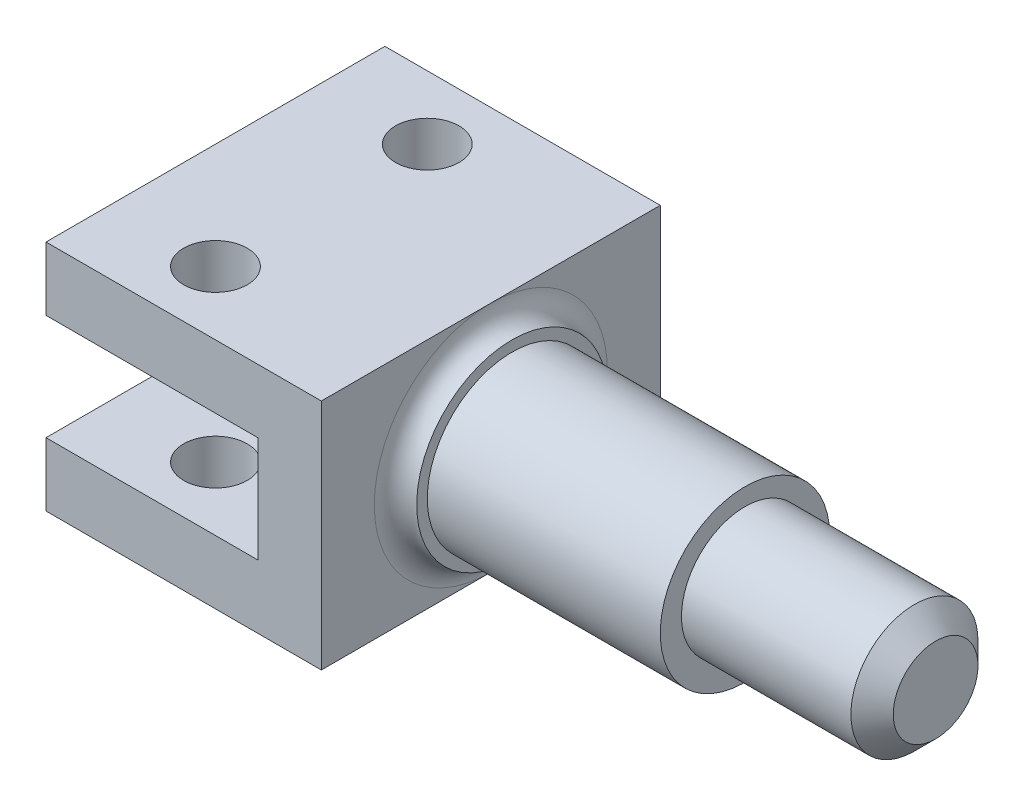
ISO-10303-21;
HEADER;
FILE_DESCRIPTION(('STEP AP214'),'2;1');
FILE_NAME('part.step','',(''),(''),'','','');
FILE_SCHEMA(('AUTOMOTIVE_DESIGN { 1 0 10303 214 1 1 1 1 }'));
ENDSEC;
DATA;
#1=APPLICATION_CONTEXT('core data for automotive mechanical design processes');
#2=APPLICATION_PROTOCOL_DEFINITION('international standard','automotive_design',2000,#1);
#3=PRODUCT_CONTEXT('',#1,'mechanical');
#4=PRODUCT('Part','Part','',(#3));
#5=PRODUCT_RELATED_PRODUCT_CATEGORY('part','',(#4));
#6=PRODUCT_DEFINITION_FORMATION('','',#4);
#7=PRODUCT_DEFINITION_CONTEXT('part definition',#1,'design');
#8=PRODUCT_DEFINITION('design','',#6,#7);
#9=PRODUCT_DEFINITION_SHAPE('','',#8);
#10=(LENGTH_UNIT() NAMED_UNIT(*) SI_UNIT(.MILLI.,.METRE.));
#11=(NAMED_UNIT(*) PLANE_ANGLE_UNIT() SI_UNIT($,.RADIAN.));
#12=(NAMED_UNIT(*) SI_UNIT($,.STERADIAN.) SOLID_ANGLE_UNIT());
#13=UNCERTAINTY_MEASURE_WITH_UNIT(LENGTH_MEASURE(1.E-05),#10,'distance_accuracy_value','');
#14=(GEOMETRIC_REPRESENTATION_CONTEXT(3) GLOBAL_UNCERTAINTY_ASSIGNED_CONTEXT((#13)) GLOBAL_UNIT_ASSIGNED_CONTEXT((#10,
#11,#12)) REPRESENTATION_CONTEXT('',''));
#15=CARTESIAN_POINT('',(0.,0.,0.));
#16=DIRECTION('',(0.,0.,1.));
#17=DIRECTION('',(1.,0.,0.));
#18=AXIS2_PLACEMENT_3D('',#15,#16,#17);
#19=CARTESIAN_POINT('',(13.,0.,16.));
#20=DIRECTION('',(-1.,0.,0.));
#21=DIRECTION('',(0.,0.,1.));
#22=AXIS2_PLACEMENT_3D('',#19,#20,#21);
#23=PLANE('',#22);
#24=DIRECTION('',(0.,0.,-1.));
#25=VECTOR('',#24,1.);
#26=CARTESIAN_POINT('',(13.,0.,16.));
#27=LINE('',#26,#25);
#28=CARTESIAN_POINT('',(13.,0.,16.));
#29=VERTEX_POINT('',#28);
#30=CARTESIAN_POINT('',(13.,0.,8.));
#31=VERTEX_POINT('',#30);
#32=EDGE_CURVE('E114',#29,#31,#27,.T.);
#33=ORIENTED_EDGE('',*,*,#32,.T.);
#34=CARTESIAN_POINT('',(13.,5.5,8.));
#35=DIRECTION('',(-1.,0.,0.));
#36=DIRECTION('',(0.,0.,1.));
#37=AXIS2_PLACEMENT_3D('',#34,#35,#36);
#38=CIRCLE('',#37,5.5);
#39=CARTESIAN_POINT('',(13.,11.,8.));
#40=VERTEX_POINT('',#39);
#41=EDGE_CURVE('E133',#31,#40,#38,.T.);
#42=ORIENTED_EDGE('',*,*,#41,.T.);
#43=DIRECTION('',(0.,0.,-1.));
#44=VECTOR('',#43,1.);
#45=CARTESIAN_POINT('',(13.,11.,16.));
#46=LINE('',#45,#44);
#47=CARTESIAN_POINT('',(13.,11.,16.));
#48=VERTEX_POINT('',#47);
#49=EDGE_CURVE('E220',#48,#40,#46,.T.);
#50=ORIENTED_EDGE('',*,*,#49,.F.);
#51=DIRECTION('',(0.,1.,0.));
#52=VECTOR('',#51,1.);
#53=CARTESIAN_POINT('',(13.,0.,16.));
#54=LINE('',#53,#52);
#55=EDGE_CURVE('E117',#29,#48,#54,.T.);
#56=ORIENTED_EDGE('',*,*,#55,.F.);
#57=EDGE_LOOP('',(#33,#42,#50,#56));
#58=FACE_BOUND('',#57,.T.);
#59=ADVANCED_FACE('F36',(#58),#23,.F.);
#60=CARTESIAN_POINT('',(0.,3.,16.));
#61=DIRECTION('',(1.,0.,0.));
#62=DIRECTION('',(0.,0.,-1.));
#63=AXIS2_PLACEMENT_3D('',#60,#61,#62);
#64=PLANE('',#63);
#65=DIRECTION('',(0.,-1.,0.));
#66=VECTOR('',#65,1.);
#67=CARTESIAN_POINT('',(0.,3.,0.));
#68=LINE('',#67,#66);
#69=CARTESIAN_POINT('',(0.,3.,0.));
#70=VERTEX_POINT('',#69);
#71=CARTESIAN_POINT('',(0.,0.,0.));
#72=VERTEX_POINT('',#71);
#73=EDGE_CURVE('E131',#70,#72,#68,.T.);
#74=ORIENTED_EDGE('',*,*,#73,.T.);
#75=DIRECTION('',(0.,0.,-1.));
#76=VECTOR('',#75,1.);
#77=CARTESIAN_POINT('',(0.,0.,16.));
#78=LINE('',#77,#76);
#79=CARTESIAN_POINT('',(0.,0.,16.));
#80=VERTEX_POINT('',#79);
#81=EDGE_CURVE('E111',#80,#72,#78,.T.);
#82=ORIENTED_EDGE('',*,*,#81,.F.);
#83=DIRECTION('',(0.,-1.,0.));
#84=VECTOR('',#83,1.);
#85=CARTESIAN_POINT('',(0.,3.,16.));
#86=LINE('',#85,#84);
#87=CARTESIAN_POINT('',(0.,3.,16.));
#88=VERTEX_POINT('',#87);
#89=EDGE_CURVE('E118',#88,#80,#86,.T.);
#90=ORIENTED_EDGE('',*,*,#89,.F.);
#91=DIRECTION('',(0.,0.,-1.));
#92=VECTOR('',#91,1.);
#93=CARTESIAN_POINT('',(0.,3.,16.));
#94=LINE('',#93,#92);
#95=EDGE_CURVE('E191',#88,#70,#94,.T.);
#96=ORIENTED_EDGE('',*,*,#95,.T.);
#97=EDGE_LOOP('',(#74,#82,#90,#96));
#98=FACE_BOUND('',#97,.T.);
#99=ADVANCED_FACE('F129',(#98),#64,.F.);
#100=CARTESIAN_POINT('',(0.,0.,16.));
#101=DIRECTION('',(0.,1.,0.));
#102=DIRECTION('',(0.,0.,1.));
#103=AXIS2_PLACEMENT_3D('',#100,#101,#102);
#104=PLANE('',#103);
#105=CARTESIAN_POINT('',(5.,0.,3.));
#106=DIRECTION('',(0.,1.,0.));
#107=DIRECTION('',(0.,0.,1.));
#108=AXIS2_PLACEMENT_3D('',#105,#106,#107);
#109=CIRCLE('',#108,1.5);
#110=CARTESIAN_POINT('',(5.,0.,4.5));
#111=VERTEX_POINT('',#110);
#112=EDGE_CURVE('E178',#111,#111,#109,.T.);
#113=ORIENTED_EDGE('',*,*,#112,.T.);
#114=EDGE_LOOP('',(#113));
#115=FACE_BOUND('',#114,.T.);
#116=CARTESIAN_POINT('',(5.,0.,13.));
#117=DIRECTION('',(0.,1.,0.));
#118=DIRECTION('',(0.,0.,1.));
#119=AXIS2_PLACEMENT_3D('',#116,#117,#118);
#120=CIRCLE('',#119,1.5);
#121=CARTESIAN_POINT('',(5.,0.,14.5));
#122=VERTEX_POINT('',#121);
#123=EDGE_CURVE('E147',#122,#122,#120,.T.);
#124=ORIENTED_EDGE('',*,*,#123,.T.);
#125=EDGE_LOOP('',(#124));
#126=FACE_BOUND('',#125,.T.);
#127=DIRECTION('',(1.,0.,0.));
#128=VECTOR('',#127,1.);
#129=CARTESIAN_POINT('',(0.,0.,0.));
#130=LINE('',#129,#128);
#131=CARTESIAN_POINT('',(13.,0.,0.));
#132=VERTEX_POINT('',#131);
#133=EDGE_CURVE('E193',#72,#132,#130,.T.);
#134=ORIENTED_EDGE('',*,*,#133,.T.);
#135=EDGE_CURVE('E135',#31,#132,#27,.T.);
#136=ORIENTED_EDGE('',*,*,#135,.F.);
#137=ORIENTED_EDGE('',*,*,#32,.F.);
#138=DIRECTION('',(1.,0.,0.));
#139=VECTOR('',#138,1.);
#140=CARTESIAN_POINT('',(0.,0.,16.));
#141=LINE('',#140,#139);
#142=EDGE_CURVE('E106',#80,#29,#141,.T.);
#143=ORIENTED_EDGE('',*,*,#142,.F.);
#144=ORIENTED_EDGE('',*,*,#81,.T.);
#145=EDGE_LOOP('',(#134,#136,#137,#143,#144));
#146=FACE_BOUND('',#145,.T.);
#147=ADVANCED_FACE('F109',(#115,#126,#146),#104,.F.);
#148=CARTESIAN_POINT('',(13.,11.,0.));
#149=VERTEX_POINT('',#148);
#150=EDGE_CURVE('E219',#40,#149,#46,.T.);
#151=ORIENTED_EDGE('',*,*,#150,.F.);
#152=CARTESIAN_POINT('',(13.,5.5,8.));
#153=DIRECTION('',(-1.,0.,0.));
#154=DIRECTION('',(0.,0.,1.));
#155=AXIS2_PLACEMENT_3D('',#152,#153,#154);
#156=CIRCLE('',#155,5.5);
#157=EDGE_CURVE('E51',#40,#31,#156,.T.);
#158=ORIENTED_EDGE('',*,*,#157,.T.);
#159=ORIENTED_EDGE('',*,*,#135,.T.);
#160=DIRECTION('',(0.,1.,0.));
#161=VECTOR('',#160,1.);
#162=CARTESIAN_POINT('',(13.,0.,0.));
#163=LINE('',#162,#161);
#164=EDGE_CURVE('E195',#132,#149,#163,.T.);
#165=ORIENTED_EDGE('',*,*,#164,.T.);
#166=EDGE_LOOP('',(#151,#158,#159,#165));
#167=FACE_BOUND('',#166,.T.);
#168=ADVANCED_FACE('F229',(#167),#23,.F.);
#169=CARTESIAN_POINT('',(13.,11.,16.));
#170=DIRECTION('',(0.,-1.,0.));
#171=DIRECTION('',(0.,0.,-1.));
#172=AXIS2_PLACEMENT_3D('',#169,#170,#171);
#173=PLANE('',#172);
#174=CARTESIAN_POINT('',(5.,11.,3.));
#175=DIRECTION('',(0.,1.,0.));
#176=DIRECTION('',(0.,0.,1.));
#177=AXIS2_PLACEMENT_3D('',#174,#175,#176);
#178=CIRCLE('',#177,1.5);
#179=CARTESIAN_POINT('',(5.,11.,4.5));
#180=VERTEX_POINT('',#179);
#181=EDGE_CURVE('E143',#180,#180,#178,.T.);
#182=ORIENTED_EDGE('',*,*,#181,.F.);
#183=EDGE_LOOP('',(#182));
#184=FACE_BOUND('',#183,.T.);
#185=CARTESIAN_POINT('',(5.,11.,13.));
#186=DIRECTION('',(0.,1.,0.));
#187=DIRECTION('',(0.,0.,-1.));
#188=AXIS2_PLACEMENT_3D('',#185,#186,#187);
#189=CIRCLE('',#188,1.5);
#190=CARTESIAN_POINT('',(5.,11.,11.5));
#191=VERTEX_POINT('',#190);
#192=EDGE_CURVE('E167',#191,#191,#189,.T.);
#193=ORIENTED_EDGE('',*,*,#192,.F.);
#194=EDGE_LOOP('',(#193));
#195=FACE_BOUND('',#194,.T.);
#196=DIRECTION('',(-1.,0.,0.));
#197=VECTOR('',#196,1.);
#198=CARTESIAN_POINT('',(13.,11.,0.));
#199=LINE('',#198,#197);
#200=CARTESIAN_POINT('',(0.,11.,0.));
#201=VERTEX_POINT('',#200);
#202=EDGE_CURVE('E198',#149,#201,#199,.T.);
#203=ORIENTED_EDGE('',*,*,#202,.T.);
#204=DIRECTION('',(0.,0.,-1.));
#205=VECTOR('',#204,1.);
#206=CARTESIAN_POINT('',(0.,11.,16.));
#207=LINE('',#206,#205);
#208=CARTESIAN_POINT('',(0.,11.,16.));
#209=VERTEX_POINT('',#208);
#210=EDGE_CURVE('E217',#209,#201,#207,.T.);
#211=ORIENTED_EDGE('',*,*,#210,.F.);
#212=DIRECTION('',(-1.,0.,0.));
#213=VECTOR('',#212,1.);
#214=CARTESIAN_POINT('',(13.,11.,16.));
#215=LINE('',#214,#213);
#216=EDGE_CURVE('E182',#48,#209,#215,.T.);
#217=ORIENTED_EDGE('',*,*,#216,.F.);
#218=ORIENTED_EDGE('',*,*,#49,.T.);
#219=ORIENTED_EDGE('',*,*,#150,.T.);
#220=EDGE_LOOP('',(#203,#211,#217,#218,#219));
#221=FACE_BOUND('',#220,.T.);
#222=ADVANCED_FACE('F225',(#184,#195,#221),#173,.F.);
#223=CARTESIAN_POINT('',(0.,11.,16.));
#224=DIRECTION('',(1.,0.,0.));
#225=DIRECTION('',(0.,0.,-1.));
#226=AXIS2_PLACEMENT_3D('',#223,#224,#225);
#227=PLANE('',#226);
#228=DIRECTION('',(0.,-1.,0.));
#229=VECTOR('',#228,1.);
#230=CARTESIAN_POINT('',(0.,11.,0.));
#231=LINE('',#230,#229);
#232=CARTESIAN_POINT('',(0.,8.,0.));
#233=VERTEX_POINT('',#232);
#234=EDGE_CURVE('E200',#201,#233,#231,.T.);
#235=ORIENTED_EDGE('',*,*,#234,.T.);
#236=DIRECTION('',(0.,0.,-1.));
#237=VECTOR('',#236,1.);
#238=CARTESIAN_POINT('',(0.,8.,16.));
#239=LINE('',#238,#237);
#240=CARTESIAN_POINT('',(0.,8.,16.));
#241=VERTEX_POINT('',#240);
#242=EDGE_CURVE('E214',#241,#233,#239,.T.);
#243=ORIENTED_EDGE('',*,*,#242,.F.);
#244=DIRECTION('',(0.,-1.,0.));
#245=VECTOR('',#244,1.);
#246=CARTESIAN_POINT('',(0.,11.,16.));
#247=LINE('',#246,#245);
#248=EDGE_CURVE('E184',#209,#241,#247,.T.);
#249=ORIENTED_EDGE('',*,*,#248,.F.);
#250=ORIENTED_EDGE('',*,*,#210,.T.);
#251=EDGE_LOOP('',(#235,#243,#249,#250));
#252=FACE_BOUND('',#251,.T.);
#253=ADVANCED_FACE('F237',(#252),#227,.F.);
#254=CARTESIAN_POINT('',(0.,8.,16.));
#255=DIRECTION('',(0.,1.,0.));
#256=DIRECTION('',(0.,0.,1.));
#257=AXIS2_PLACEMENT_3D('',#254,#255,#256);
#258=PLANE('',#257);
#259=CARTESIAN_POINT('',(5.,8.,3.));
#260=DIRECTION('',(0.,1.,0.));
#261=DIRECTION('',(0.,0.,1.));
#262=AXIS2_PLACEMENT_3D('',#259,#260,#261);
#263=CIRCLE('',#262,1.5);
#264=CARTESIAN_POINT('',(5.,8.,4.5));
#265=VERTEX_POINT('',#264);
#266=EDGE_CURVE('E146',#265,#265,#263,.T.);
#267=ORIENTED_EDGE('',*,*,#266,.T.);
#268=EDGE_LOOP('',(#267));
#269=FACE_BOUND('',#268,.T.);
#270=CARTESIAN_POINT('',(5.,8.,13.));
#271=DIRECTION('',(0.,1.,0.));
#272=DIRECTION('',(0.,0.,1.));
#273=AXIS2_PLACEMENT_3D('',#270,#271,#272);
#274=CIRCLE('',#273,1.5);
#275=CARTESIAN_POINT('',(5.,8.,14.5));
#276=VERTEX_POINT('',#275);
#277=EDGE_CURVE('E142',#276,#276,#274,.T.);
#278=ORIENTED_EDGE('',*,*,#277,.T.);
#279=EDGE_LOOP('',(#278));
#280=FACE_BOUND('',#279,.T.);
#281=DIRECTION('',(1.,0.,0.));
#282=VECTOR('',#281,1.);
#283=CARTESIAN_POINT('',(0.,8.,0.));
#284=LINE('',#283,#282);
#285=CARTESIAN_POINT('',(10.,8.,0.));
#286=VERTEX_POINT('',#285);
#287=EDGE_CURVE('E202',#233,#286,#284,.T.);
#288=ORIENTED_EDGE('',*,*,#287,.T.);
#289=DIRECTION('',(0.,0.,-1.));
#290=VECTOR('',#289,1.);
#291=CARTESIAN_POINT('',(10.,8.,16.));
#292=LINE('',#291,#290);
#293=CARTESIAN_POINT('',(10.,8.,16.));
#294=VERTEX_POINT('',#293);
#295=EDGE_CURVE('E211',#294,#286,#292,.T.);
#296=ORIENTED_EDGE('',*,*,#295,.F.);
#297=DIRECTION('',(1.,0.,0.));
#298=VECTOR('',#297,1.);
#299=CARTESIAN_POINT('',(0.,8.,16.));
#300=LINE('',#299,#298);
#301=EDGE_CURVE('E186',#241,#294,#300,.T.);
#302=ORIENTED_EDGE('',*,*,#301,.F.);
#303=ORIENTED_EDGE('',*,*,#242,.T.);
#304=EDGE_LOOP('',(#288,#296,#302,#303));
#305=FACE_BOUND('',#304,.T.);
#306=ADVANCED_FACE('F241',(#269,#280,#305),#258,.F.);
#307=CARTESIAN_POINT('',(10.,8.,16.));
#308=DIRECTION('',(1.,0.,0.));
#309=DIRECTION('',(0.,0.,-1.));
#310=AXIS2_PLACEMENT_3D('',#307,#308,#309);
#311=PLANE('',#310);
#312=DIRECTION('',(0.,-1.,0.));
#313=VECTOR('',#312,1.);
#314=CARTESIAN_POINT('',(10.,8.,0.));
#315=LINE('',#314,#313);
#316=CARTESIAN_POINT('',(10.,3.,0.));
#317=VERTEX_POINT('',#316);
#318=EDGE_CURVE('E204',#286,#317,#315,.T.);
#319=ORIENTED_EDGE('',*,*,#318,.T.);
#320=DIRECTION('',(0.,0.,-1.));
#321=VECTOR('',#320,1.);
#322=CARTESIAN_POINT('',(10.,3.,16.));
#323=LINE('',#322,#321);
#324=CARTESIAN_POINT('',(10.,3.,16.));
#325=VERTEX_POINT('',#324);
#326=EDGE_CURVE('E208',#325,#317,#323,.T.);
#327=ORIENTED_EDGE('',*,*,#326,.F.);
#328=DIRECTION('',(0.,-1.,0.));
#329=VECTOR('',#328,1.);
#330=CARTESIAN_POINT('',(10.,8.,16.));
#331=LINE('',#330,#329);
#332=EDGE_CURVE('E188',#294,#325,#331,.T.);
#333=ORIENTED_EDGE('',*,*,#332,.F.);
#334=ORIENTED_EDGE('',*,*,#295,.T.);
#335=EDGE_LOOP('',(#319,#327,#333,#334));
#336=FACE_BOUND('',#335,.T.);
#337=ADVANCED_FACE('F308',(#336),#311,.F.);
#338=CARTESIAN_POINT('',(10.,3.,16.));
#339=DIRECTION('',(0.,-1.,0.));
#340=DIRECTION('',(0.,0.,-1.));
#341=AXIS2_PLACEMENT_3D('',#338,#339,#340);
#342=PLANE('',#341);
#343=CARTESIAN_POINT('',(5.,3.,3.));
#344=DIRECTION('',(0.,-1.,0.));
#345=DIRECTION('',(0.,0.,-1.));
#346=AXIS2_PLACEMENT_3D('',#343,#344,#345);
#347=CIRCLE('',#346,1.5);
#348=CARTESIAN_POINT('',(5.,3.,1.5));
#349=VERTEX_POINT('',#348);
#350=EDGE_CURVE('E144',#349,#349,#347,.T.);
#351=ORIENTED_EDGE('',*,*,#350,.T.);
#352=EDGE_LOOP('',(#351));
#353=FACE_BOUND('',#352,.T.);
#354=CARTESIAN_POINT('',(5.,3.,13.));
#355=DIRECTION('',(0.,-1.,0.));
#356=DIRECTION('',(0.,0.,-1.));
#357=AXIS2_PLACEMENT_3D('',#354,#355,#356);
#358=CIRCLE('',#357,1.5);
#359=CARTESIAN_POINT('',(5.,3.,11.5));
#360=VERTEX_POINT('',#359);
#361=EDGE_CURVE('E139',#360,#360,#358,.T.);
#362=ORIENTED_EDGE('',*,*,#361,.T.);
#363=EDGE_LOOP('',(#362));
#364=FACE_BOUND('',#363,.T.);
#365=DIRECTION('',(-1.,0.,0.));
#366=VECTOR('',#365,1.);
#367=CARTESIAN_POINT('',(10.,3.,0.));
#368=LINE('',#367,#366);
#369=EDGE_CURVE('E127',#317,#70,#368,.T.);
#370=ORIENTED_EDGE('',*,*,#369,.T.);
#371=ORIENTED_EDGE('',*,*,#95,.F.);
#372=DIRECTION('',(-1.,0.,0.));
#373=VECTOR('',#372,1.);
#374=CARTESIAN_POINT('',(10.,3.,16.));
#375=LINE('',#374,#373);
#376=EDGE_CURVE('E123',#325,#88,#375,.T.);
#377=ORIENTED_EDGE('',*,*,#376,.F.);
#378=ORIENTED_EDGE('',*,*,#326,.T.);
#379=EDGE_LOOP('',(#370,#371,#377,#378));
#380=FACE_BOUND('',#379,.T.);
#381=ADVANCED_FACE('F315',(#353,#364,#380),#342,.F.);
#382=CARTESIAN_POINT('',(0.,0.,16.));
#383=DIRECTION('',(0.,0.,1.));
#384=DIRECTION('',(1.,0.,0.));
#385=AXIS2_PLACEMENT_3D('',#382,#383,#384);
#386=PLANE('',#385);
#387=ORIENTED_EDGE('',*,*,#89,.T.);
#388=ORIENTED_EDGE('',*,*,#142,.T.);
#389=ORIENTED_EDGE('',*,*,#55,.T.);
#390=ORIENTED_EDGE('',*,*,#216,.T.);
#391=ORIENTED_EDGE('',*,*,#248,.T.);
#392=ORIENTED_EDGE('',*,*,#301,.T.);
#393=ORIENTED_EDGE('',*,*,#332,.T.);
#394=ORIENTED_EDGE('',*,*,#376,.T.);
#395=EDGE_LOOP('',(#387,#388,#389,#390,#391,#392,#393,#394));
#396=FACE_BOUND('',#395,.T.);
#397=ADVANCED_FACE('F121',(#396),#386,.T.);
#398=CARTESIAN_POINT('',(0.,0.,0.));
#399=DIRECTION('',(0.,0.,1.));
#400=DIRECTION('',(1.,0.,0.));
#401=AXIS2_PLACEMENT_3D('',#398,#399,#400);
#402=PLANE('',#401);
#403=ORIENTED_EDGE('',*,*,#73,.F.);
#404=ORIENTED_EDGE('',*,*,#369,.F.);
#405=ORIENTED_EDGE('',*,*,#318,.F.);
#406=ORIENTED_EDGE('',*,*,#287,.F.);
#407=ORIENTED_EDGE('',*,*,#234,.F.);
#408=ORIENTED_EDGE('',*,*,#202,.F.);
#409=ORIENTED_EDGE('',*,*,#164,.F.);
#410=ORIENTED_EDGE('',*,*,#133,.F.);
#411=EDGE_LOOP('',(#403,#404,#405,#406,#407,#408,#409,#410));
#412=FACE_BOUND('',#411,.T.);
#413=ADVANCED_FACE('F232',(#412),#402,.F.);
#414=CARTESIAN_POINT('',(5.,-5.,13.));
#415=DIRECTION('',(0.,1.,0.));
#416=DIRECTION('',(0.,0.,1.));
#417=AXIS2_PLACEMENT_3D('',#414,#415,#416);
#418=CYLINDRICAL_SURFACE('',#417,1.5);
#419=ORIENTED_EDGE('',*,*,#361,.F.);
#420=EDGE_LOOP('',(#419));
#421=FACE_BOUND('',#420,.T.);
#422=ORIENTED_EDGE('',*,*,#123,.F.);
#423=EDGE_LOOP('',(#422));
#424=FACE_BOUND('',#423,.T.);
#425=ADVANCED_FACE('F287',(#421,#424),#418,.F.);
#426=CARTESIAN_POINT('',(5.,-5.,3.));
#427=DIRECTION('',(0.,1.,0.));
#428=DIRECTION('',(0.,0.,1.));
#429=AXIS2_PLACEMENT_3D('',#426,#427,#428);
#430=CYLINDRICAL_SURFACE('',#429,1.5);
#431=ORIENTED_EDGE('',*,*,#350,.F.);
#432=EDGE_LOOP('',(#431));
#433=FACE_BOUND('',#432,.T.);
#434=ORIENTED_EDGE('',*,*,#112,.F.);
#435=EDGE_LOOP('',(#434));
#436=FACE_BOUND('',#435,.T.);
#437=ADVANCED_FACE('F263',(#433,#436),#430,.F.);
#438=ORIENTED_EDGE('',*,*,#192,.T.);
#439=EDGE_LOOP('',(#438));
#440=FACE_BOUND('',#439,.T.);
#441=ORIENTED_EDGE('',*,*,#277,.F.);
#442=EDGE_LOOP('',(#441));
#443=FACE_BOUND('',#442,.T.);
#444=ADVANCED_FACE('F260',(#440,#443),#418,.F.);
#445=ORIENTED_EDGE('',*,*,#181,.T.);
#446=EDGE_LOOP('',(#445));
#447=FACE_BOUND('',#446,.T.);
#448=ORIENTED_EDGE('',*,*,#266,.F.);
#449=EDGE_LOOP('',(#448));
#450=FACE_BOUND('',#449,.T.);
#451=ADVANCED_FACE('F254',(#447,#450),#430,.F.);
#452=CARTESIAN_POINT('',(14.,5.5,8.));
#453=DIRECTION('',(1.,0.,0.));
#454=DIRECTION('',(0.,0.,-1.));
#455=AXIS2_PLACEMENT_3D('',#452,#453,#454);
#456=PLANE('',#455);
#457=CARTESIAN_POINT('',(14.,5.5,8.));
#458=DIRECTION('',(1.,0.,0.));
#459=DIRECTION('',(0.,0.,-1.));
#460=AXIS2_PLACEMENT_3D('',#457,#458,#459);
#461=CIRCLE('',#460,4.);
#462=CARTESIAN_POINT('',(14.,5.5,4.));
#463=VERTEX_POINT('',#462);
#464=EDGE_CURVE('E162',#463,#463,#461,.T.);
#465=ORIENTED_EDGE('',*,*,#464,.F.);
#466=EDGE_LOOP('',(#465));
#467=FACE_BOUND('',#466,.T.);
#468=CARTESIAN_POINT('',(14.,5.5,8.));
#469=DIRECTION('',(1.,0.,0.));
#470=DIRECTION('',(0.,0.,-1.));
#471=AXIS2_PLACEMENT_3D('',#468,#469,#470);
#472=CIRCLE('',#471,4.5);
#473=CARTESIAN_POINT('',(14.,5.5,3.5));
#474=VERTEX_POINT('',#473);
#475=EDGE_CURVE('E161',#474,#474,#472,.T.);
#476=ORIENTED_EDGE('',*,*,#475,.T.);
#477=EDGE_LOOP('',(#476));
#478=FACE_BOUND('',#477,.T.);
#479=ADVANCED_FACE('F250',(#467,#478),#456,.T.);
#480=CARTESIAN_POINT('',(14.,5.5,8.));
#481=DIRECTION('',(-1.,0.,0.));
#482=DIRECTION('',(0.,0.,1.));
#483=AXIS2_PLACEMENT_3D('',#480,#481,#482);
#484=TOROIDAL_SURFACE('',#483,5.5,1.);
#485=ORIENTED_EDGE('',*,*,#157,.F.);
#486=ORIENTED_EDGE('',*,*,#41,.F.);
#487=EDGE_LOOP('',(#485,#486));
#488=FACE_BOUND('',#487,.T.);
#489=ORIENTED_EDGE('',*,*,#475,.F.);
#490=EDGE_LOOP('',(#489));
#491=FACE_BOUND('',#490,.T.);
#492=ADVANCED_FACE('F246',(#488,#491),#484,.F.);
#493=CARTESIAN_POINT('',(25.,5.5,8.));
#494=DIRECTION('',(-1.,0.,0.));
#495=DIRECTION('',(0.,0.,1.));
#496=AXIS2_PLACEMENT_3D('',#493,#494,#495);
#497=CYLINDRICAL_SURFACE('',#496,4.);
#498=CARTESIAN_POINT('',(25.,5.5,8.));
#499=DIRECTION('',(1.,0.,0.));
#500=DIRECTION('',(0.,0.,-1.));
#501=AXIS2_PLACEMENT_3D('',#498,#499,#500);
#502=CIRCLE('',#501,4.);
#503=CARTESIAN_POINT('',(25.,5.5,4.));
#504=VERTEX_POINT('',#503);
#505=EDGE_CURVE('E158',#504,#504,#502,.T.);
#506=ORIENTED_EDGE('',*,*,#505,.F.);
#507=EDGE_LOOP('',(#506));
#508=FACE_BOUND('',#507,.T.);
#509=ORIENTED_EDGE('',*,*,#464,.T.);
#510=EDGE_LOOP('',(#509));
#511=FACE_BOUND('',#510,.T.);
#512=ADVANCED_FACE('F249',(#508,#511),#497,.T.);
#513=CARTESIAN_POINT('',(25.,5.5,8.));
#514=DIRECTION('',(1.,0.,0.));
#515=DIRECTION('',(0.,0.,-1.));
#516=AXIS2_PLACEMENT_3D('',#513,#514,#515);
#517=PLANE('',#516);
#518=CARTESIAN_POINT('',(25.,5.68328166406218,8.));
#519=DIRECTION('',(1.,0.,0.));
#520=DIRECTION('',(0.,0.,-1.));
#521=AXIS2_PLACEMENT_3D('',#518,#519,#520);
#522=CIRCLE('',#521,3.);
#523=CARTESIAN_POINT('',(25.,5.68328166406218,5.));
#524=VERTEX_POINT('',#523);
#525=EDGE_CURVE('E149',#524,#524,#522,.T.);
#526=ORIENTED_EDGE('',*,*,#525,.F.);
#527=EDGE_LOOP('',(#526));
#528=FACE_BOUND('',#527,.T.);
#529=ORIENTED_EDGE('',*,*,#505,.T.);
#530=EDGE_LOOP('',(#529));
#531=FACE_BOUND('',#530,.T.);
#532=ADVANCED_FACE('F400',(#528,#531),#517,.T.);
#533=CARTESIAN_POINT('',(34.,5.68328166406218,8.));
#534=DIRECTION('',(-1.,0.,0.));
#535=DIRECTION('',(0.,0.,1.));
#536=AXIS2_PLACEMENT_3D('',#533,#534,#535);
#537=CYLINDRICAL_SURFACE('',#536,3.);
#538=CARTESIAN_POINT('',(33.,5.68328166406218,8.));
#539=DIRECTION('',(1.,0.,0.));
#540=DIRECTION('',(0.,0.,-1.));
#541=AXIS2_PLACEMENT_3D('',#538,#539,#540);
#542=CIRCLE('',#541,3.);
#543=CARTESIAN_POINT('',(33.,5.68328166406218,5.));
#544=VERTEX_POINT('',#543);
#545=EDGE_CURVE('E11',#544,#544,#542,.F.);
#546=ORIENTED_EDGE('',*,*,#545,.T.);
#547=EDGE_LOOP('',(#546));
#548=FACE_BOUND('',#547,.T.);
#549=ORIENTED_EDGE('',*,*,#525,.T.);
#550=EDGE_LOOP('',(#549));
#551=FACE_BOUND('',#550,.T.);
#552=ADVANCED_FACE('F409',(#548,#551),#537,.T.);
#553=CARTESIAN_POINT('',(34.,5.68328166406218,8.));
#554=DIRECTION('',(1.,0.,0.));
#555=DIRECTION('',(0.,0.,-1.));
#556=AXIS2_PLACEMENT_3D('',#553,#554,#555);
#557=PLANE('',#556);
#558=CARTESIAN_POINT('',(34.,5.68328166406218,8.));
#559=DIRECTION('',(1.,0.,0.));
#560=DIRECTION('',(0.,0.,-1.));
#561=AXIS2_PLACEMENT_3D('',#558,#559,#560);
#562=CIRCLE('',#561,2.);
#563=CARTESIAN_POINT('',(34.,5.68328166406218,6.));
#564=VERTEX_POINT('',#563);
#565=EDGE_CURVE('E44',#564,#564,#562,.T.);
#566=ORIENTED_EDGE('',*,*,#565,.T.);
#567=EDGE_LOOP('',(#566));
#568=FACE_BOUND('',#567,.T.);
#569=ADVANCED_FACE('F419',(#568),#557,.T.);
#570=CARTESIAN_POINT('',(34.,5.68328166406218,8.));
#571=DIRECTION('',(-1.,0.,0.));
#572=DIRECTION('',(0.,0.,1.));
#573=AXIS2_PLACEMENT_3D('',#570,#571,#572);
#574=CONICAL_SURFACE('',#573,2.,0.785398163397446);
#575=ORIENTED_EDGE('',*,*,#545,.F.);
#576=EDGE_LOOP('',(#575));
#577=FACE_BOUND('',#576,.T.);
#578=ORIENTED_EDGE('',*,*,#565,.F.);
#579=EDGE_LOOP('',(#578));
#580=FACE_BOUND('',#579,.T.);
#581=ADVANCED_FACE('F38',(#577,#580),#574,.T.);
#582=CLOSED_SHELL('',(#59,#99,#147,#168,#222,#253,#306,#337,#381,#397,#413,#425,#437,#444,#451,
#479,#492,#512,#532,#552,#569,#581));
#583=MANIFOLD_SOLID_BREP('B2',#582);
#584=ADVANCED_BREP_SHAPE_REPRESENTATION('',(#18,#583),#14);
#585=SHAPE_DEFINITION_REPRESENTATION(#9,#584);
ENDSEC;
END-ISO-10303-21;
